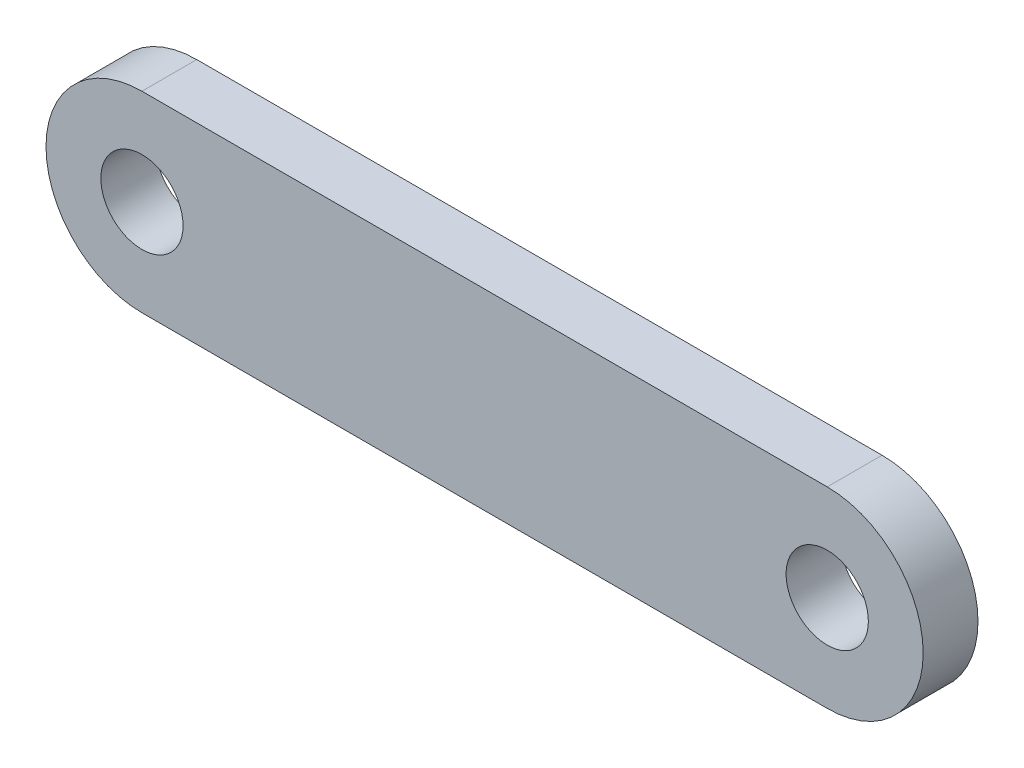
ISO-10303-21;
HEADER;
FILE_DESCRIPTION(('STEP AP214'),'2;1');
FILE_NAME('part.step','',(''),(''),'','','');
FILE_SCHEMA(('AUTOMOTIVE_DESIGN { 1 0 10303 214 1 1 1 1 }'));
ENDSEC;
DATA;
#1=APPLICATION_CONTEXT('core data for automotive mechanical design processes');
#2=APPLICATION_PROTOCOL_DEFINITION('international standard','automotive_design',2000,#1);
#3=PRODUCT_CONTEXT('',#1,'mechanical');
#4=PRODUCT('Part','Part','',(#3));
#5=PRODUCT_RELATED_PRODUCT_CATEGORY('part','',(#4));
#6=PRODUCT_DEFINITION_FORMATION('','',#4);
#7=PRODUCT_DEFINITION_CONTEXT('part definition',#1,'design');
#8=PRODUCT_DEFINITION('design','',#6,#7);
#9=PRODUCT_DEFINITION_SHAPE('','',#8);
#10=(LENGTH_UNIT() NAMED_UNIT(*) SI_UNIT(.MILLI.,.METRE.));
#11=(NAMED_UNIT(*) PLANE_ANGLE_UNIT() SI_UNIT($,.RADIAN.));
#12=(NAMED_UNIT(*) SI_UNIT($,.STERADIAN.) SOLID_ANGLE_UNIT());
#13=UNCERTAINTY_MEASURE_WITH_UNIT(LENGTH_MEASURE(1.E-05),#10,'distance_accuracy_value','');
#14=(GEOMETRIC_REPRESENTATION_CONTEXT(3) GLOBAL_UNCERTAINTY_ASSIGNED_CONTEXT((#13)) GLOBAL_UNIT_ASSIGNED_CONTEXT((#10,
#11,#12)) REPRESENTATION_CONTEXT('',''));
#15=CARTESIAN_POINT('',(0.,0.,0.));
#16=DIRECTION('',(0.,0.,1.));
#17=DIRECTION('',(1.,0.,0.));
#18=AXIS2_PLACEMENT_3D('',#15,#16,#17);
#19=CARTESIAN_POINT('',(-12.5,0.,1.));
#20=DIRECTION('',(0.,0.,1.));
#21=DIRECTION('',(1.,0.,0.));
#22=AXIS2_PLACEMENT_3D('',#19,#20,#21);
#23=PLANE('',#22);
#24=CARTESIAN_POINT('',(12.5,0.,1.));
#25=DIRECTION('',(0.,0.,1.));
#26=DIRECTION('',(1.,0.,0.));
#27=AXIS2_PLACEMENT_3D('',#24,#25,#26);
#28=CIRCLE('',#27,1.5);
#29=CARTESIAN_POINT('',(14.,0.,1.));
#30=VERTEX_POINT('',#29);
#31=EDGE_CURVE('E102',#30,#30,#28,.T.);
#32=ORIENTED_EDGE('',*,*,#31,.F.);
#33=EDGE_LOOP('',(#32));
#34=FACE_BOUND('',#33,.T.);
#35=CARTESIAN_POINT('',(-12.5,0.,1.));
#36=DIRECTION('',(0.,0.,1.));
#37=DIRECTION('',(1.,0.,0.));
#38=AXIS2_PLACEMENT_3D('',#35,#36,#37);
#39=CIRCLE('',#38,3.5);
#40=CARTESIAN_POINT('',(-12.5,3.5,1.));
#41=VERTEX_POINT('',#40);
#42=CARTESIAN_POINT('',(-12.5,-3.5,1.));
#43=VERTEX_POINT('',#42);
#44=EDGE_CURVE('E87',#41,#43,#39,.T.);
#45=ORIENTED_EDGE('',*,*,#44,.T.);
#46=DIRECTION('',(1.,0.,0.));
#47=VECTOR('',#46,1.);
#48=CARTESIAN_POINT('',(-12.5,-3.5,1.));
#49=LINE('',#48,#47);
#50=CARTESIAN_POINT('',(12.5,-3.5,1.));
#51=VERTEX_POINT('',#50);
#52=EDGE_CURVE('E82',#43,#51,#49,.T.);
#53=ORIENTED_EDGE('',*,*,#52,.T.);
#54=CARTESIAN_POINT('',(12.5,0.,1.));
#55=DIRECTION('',(0.,0.,1.));
#56=DIRECTION('',(1.,0.,0.));
#57=AXIS2_PLACEMENT_3D('',#54,#55,#56);
#58=CIRCLE('',#57,3.5);
#59=CARTESIAN_POINT('',(12.5,3.50000000000001,1.));
#60=VERTEX_POINT('',#59);
#61=EDGE_CURVE('E85',#51,#60,#58,.T.);
#62=ORIENTED_EDGE('',*,*,#61,.T.);
#63=DIRECTION('',(-1.,0.,0.));
#64=VECTOR('',#63,1.);
#65=CARTESIAN_POINT('',(-12.5,3.5,1.));
#66=LINE('',#65,#64);
#67=EDGE_CURVE('E52',#60,#41,#66,.T.);
#68=ORIENTED_EDGE('',*,*,#67,.T.);
#69=EDGE_LOOP('',(#45,#53,#62,#68));
#70=FACE_BOUND('',#69,.T.);
#71=CARTESIAN_POINT('',(-12.5,0.,1.));
#72=DIRECTION('',(0.,0.,1.));
#73=DIRECTION('',(1.,0.,0.));
#74=AXIS2_PLACEMENT_3D('',#71,#72,#73);
#75=CIRCLE('',#74,1.5);
#76=CARTESIAN_POINT('',(-11.,0.,1.));
#77=VERTEX_POINT('',#76);
#78=EDGE_CURVE('E117',#77,#77,#75,.T.);
#79=ORIENTED_EDGE('',*,*,#78,.F.);
#80=EDGE_LOOP('',(#79));
#81=FACE_BOUND('',#80,.T.);
#82=ADVANCED_FACE('F35',(#34,#70,#81),#23,.T.);
#83=CARTESIAN_POINT('',(-12.5,0.,-1.));
#84=DIRECTION('',(0.,0.,1.));
#85=DIRECTION('',(1.,0.,0.));
#86=AXIS2_PLACEMENT_3D('',#83,#84,#85);
#87=PLANE('',#86);
#88=CARTESIAN_POINT('',(-12.5,0.,-1.));
#89=DIRECTION('',(0.,0.,1.));
#90=DIRECTION('',(1.,0.,0.));
#91=AXIS2_PLACEMENT_3D('',#88,#89,#90);
#92=CIRCLE('',#91,3.5);
#93=CARTESIAN_POINT('',(-12.5,3.5,-1.));
#94=VERTEX_POINT('',#93);
#95=CARTESIAN_POINT('',(-12.5,-3.5,-1.));
#96=VERTEX_POINT('',#95);
#97=EDGE_CURVE('E99',#94,#96,#92,.T.);
#98=ORIENTED_EDGE('',*,*,#97,.F.);
#99=DIRECTION('',(-1.,0.,0.));
#100=VECTOR('',#99,1.);
#101=CARTESIAN_POINT('',(-12.5,3.5,-1.));
#102=LINE('',#101,#100);
#103=CARTESIAN_POINT('',(12.5,3.50000000000001,-1.));
#104=VERTEX_POINT('',#103);
#105=EDGE_CURVE('E75',#104,#94,#102,.T.);
#106=ORIENTED_EDGE('',*,*,#105,.F.);
#107=CARTESIAN_POINT('',(12.5,0.,-1.));
#108=DIRECTION('',(0.,0.,1.));
#109=DIRECTION('',(1.,0.,0.));
#110=AXIS2_PLACEMENT_3D('',#107,#108,#109);
#111=CIRCLE('',#110,3.5);
#112=CARTESIAN_POINT('',(12.5,-3.5,-1.));
#113=VERTEX_POINT('',#112);
#114=EDGE_CURVE('E69',#113,#104,#111,.T.);
#115=ORIENTED_EDGE('',*,*,#114,.F.);
#116=DIRECTION('',(1.,0.,0.));
#117=VECTOR('',#116,1.);
#118=CARTESIAN_POINT('',(-12.5,-3.5,-1.));
#119=LINE('',#118,#117);
#120=EDGE_CURVE('E91',#96,#113,#119,.T.);
#121=ORIENTED_EDGE('',*,*,#120,.F.);
#122=EDGE_LOOP('',(#98,#106,#115,#121));
#123=FACE_BOUND('',#122,.T.);
#124=CARTESIAN_POINT('',(12.5,0.,-1.));
#125=DIRECTION('',(0.,0.,1.));
#126=DIRECTION('',(1.,0.,0.));
#127=AXIS2_PLACEMENT_3D('',#124,#125,#126);
#128=CIRCLE('',#127,1.5);
#129=CARTESIAN_POINT('',(14.,0.,-1.));
#130=VERTEX_POINT('',#129);
#131=EDGE_CURVE('E114',#130,#130,#128,.T.);
#132=ORIENTED_EDGE('',*,*,#131,.T.);
#133=EDGE_LOOP('',(#132));
#134=FACE_BOUND('',#133,.T.);
#135=CARTESIAN_POINT('',(-12.5,0.,-1.));
#136=DIRECTION('',(0.,0.,1.));
#137=DIRECTION('',(1.,0.,0.));
#138=AXIS2_PLACEMENT_3D('',#135,#136,#137);
#139=CIRCLE('',#138,1.5);
#140=CARTESIAN_POINT('',(-11.,0.,-1.));
#141=VERTEX_POINT('',#140);
#142=EDGE_CURVE('E120',#141,#141,#139,.T.);
#143=ORIENTED_EDGE('',*,*,#142,.T.);
#144=EDGE_LOOP('',(#143));
#145=FACE_BOUND('',#144,.T.);
#146=ADVANCED_FACE('F110',(#123,#134,#145),#87,.F.);
#147=CARTESIAN_POINT('',(-12.5,0.,1.));
#148=DIRECTION('',(0.,0.,-1.));
#149=DIRECTION('',(-1.,0.,0.));
#150=AXIS2_PLACEMENT_3D('',#147,#148,#149);
#151=CYLINDRICAL_SURFACE('',#150,3.5);
#152=ORIENTED_EDGE('',*,*,#97,.T.);
#153=DIRECTION('',(0.,0.,-1.));
#154=VECTOR('',#153,1.);
#155=CARTESIAN_POINT('',(-12.5,-3.5,1.));
#156=LINE('',#155,#154);
#157=EDGE_CURVE('E11',#43,#96,#156,.T.);
#158=ORIENTED_EDGE('',*,*,#157,.F.);
#159=ORIENTED_EDGE('',*,*,#44,.F.);
#160=DIRECTION('',(0.,0.,-1.));
#161=VECTOR('',#160,1.);
#162=CARTESIAN_POINT('',(-12.5,3.5,1.));
#163=LINE('',#162,#161);
#164=EDGE_CURVE('E95',#41,#94,#163,.T.);
#165=ORIENTED_EDGE('',*,*,#164,.T.);
#166=EDGE_LOOP('',(#152,#158,#159,#165));
#167=FACE_BOUND('',#166,.T.);
#168=ADVANCED_FACE('F37',(#167),#151,.T.);
#169=CARTESIAN_POINT('',(-12.5,-3.5,1.));
#170=DIRECTION('',(0.,1.,0.));
#171=DIRECTION('',(-1.,0.,0.));
#172=AXIS2_PLACEMENT_3D('',#169,#170,#171);
#173=PLANE('',#172);
#174=ORIENTED_EDGE('',*,*,#120,.T.);
#175=DIRECTION('',(0.,0.,-1.));
#176=VECTOR('',#175,1.);
#177=CARTESIAN_POINT('',(12.5,-3.5,1.));
#178=LINE('',#177,#176);
#179=EDGE_CURVE('E44',#51,#113,#178,.T.);
#180=ORIENTED_EDGE('',*,*,#179,.F.);
#181=ORIENTED_EDGE('',*,*,#52,.F.);
#182=ORIENTED_EDGE('',*,*,#157,.T.);
#183=EDGE_LOOP('',(#174,#180,#181,#182));
#184=FACE_BOUND('',#183,.T.);
#185=ADVANCED_FACE('F90',(#184),#173,.F.);
#186=CARTESIAN_POINT('',(12.5,0.,1.));
#187=DIRECTION('',(0.,0.,-1.));
#188=DIRECTION('',(-1.,0.,0.));
#189=AXIS2_PLACEMENT_3D('',#186,#187,#188);
#190=CYLINDRICAL_SURFACE('',#189,3.5);
#191=ORIENTED_EDGE('',*,*,#114,.T.);
#192=DIRECTION('',(0.,0.,-1.));
#193=VECTOR('',#192,1.);
#194=CARTESIAN_POINT('',(12.5,3.50000000000001,1.));
#195=LINE('',#194,#193);
#196=EDGE_CURVE('E92',#60,#104,#195,.T.);
#197=ORIENTED_EDGE('',*,*,#196,.F.);
#198=ORIENTED_EDGE('',*,*,#61,.F.);
#199=ORIENTED_EDGE('',*,*,#179,.T.);
#200=EDGE_LOOP('',(#191,#197,#198,#199));
#201=FACE_BOUND('',#200,.T.);
#202=ADVANCED_FACE('F93',(#201),#190,.T.);
#203=CARTESIAN_POINT('',(-12.5,3.5,1.));
#204=DIRECTION('',(0.,-1.,0.));
#205=DIRECTION('',(1.,0.,0.));
#206=AXIS2_PLACEMENT_3D('',#203,#204,#205);
#207=PLANE('',#206);
#208=ORIENTED_EDGE('',*,*,#105,.T.);
#209=ORIENTED_EDGE('',*,*,#164,.F.);
#210=ORIENTED_EDGE('',*,*,#67,.F.);
#211=ORIENTED_EDGE('',*,*,#196,.T.);
#212=EDGE_LOOP('',(#208,#209,#210,#211));
#213=FACE_BOUND('',#212,.T.);
#214=ADVANCED_FACE('F107',(#213),#207,.F.);
#215=CARTESIAN_POINT('',(12.5,0.,1.));
#216=DIRECTION('',(0.,0.,-1.));
#217=DIRECTION('',(-1.,0.,0.));
#218=AXIS2_PLACEMENT_3D('',#215,#216,#217);
#219=CYLINDRICAL_SURFACE('',#218,1.5);
#220=ORIENTED_EDGE('',*,*,#31,.T.);
#221=EDGE_LOOP('',(#220));
#222=FACE_BOUND('',#221,.T.);
#223=ORIENTED_EDGE('',*,*,#131,.F.);
#224=EDGE_LOOP('',(#223));
#225=FACE_BOUND('',#224,.T.);
#226=ADVANCED_FACE('F137',(#222,#225),#219,.F.);
#227=CARTESIAN_POINT('',(-12.5,0.,1.));
#228=DIRECTION('',(0.,0.,-1.));
#229=DIRECTION('',(-1.,0.,0.));
#230=AXIS2_PLACEMENT_3D('',#227,#228,#229);
#231=CYLINDRICAL_SURFACE('',#230,1.5);
#232=ORIENTED_EDGE('',*,*,#78,.T.);
#233=EDGE_LOOP('',(#232));
#234=FACE_BOUND('',#233,.T.);
#235=ORIENTED_EDGE('',*,*,#142,.F.);
#236=EDGE_LOOP('',(#235));
#237=FACE_BOUND('',#236,.T.);
#238=ADVANCED_FACE('F126',(#234,#237),#231,.F.);
#239=CLOSED_SHELL('',(#82,#146,#168,#185,#202,#214,#226,#238));
#240=MANIFOLD_SOLID_BREP('B2',#239);
#241=ADVANCED_BREP_SHAPE_REPRESENTATION('',(#18,#240),#14);
#242=SHAPE_DEFINITION_REPRESENTATION(#9,#241);
ENDSEC;
END-ISO-10303-21;
